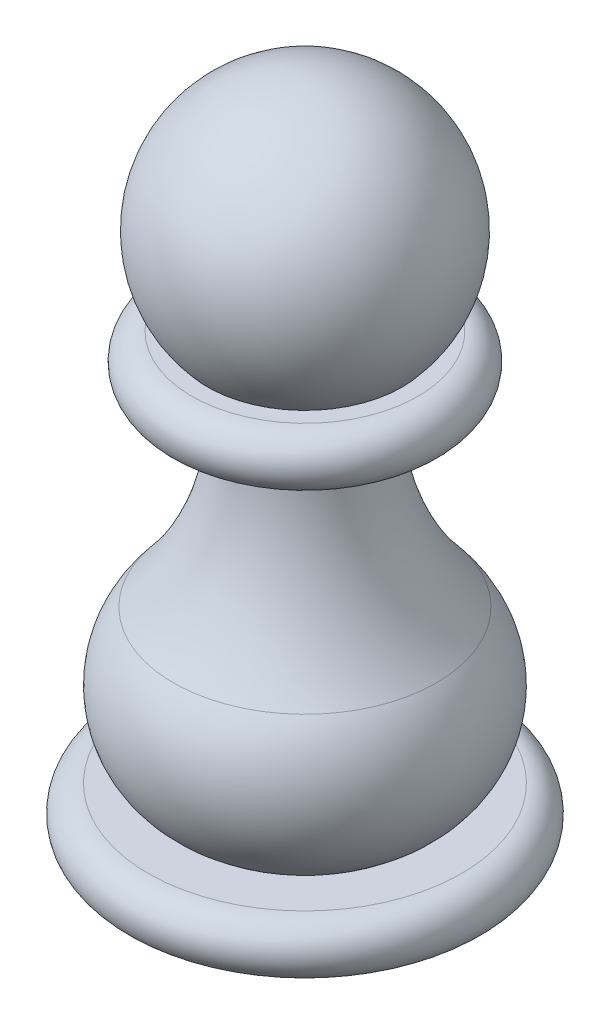
ISO-10303-21;
HEADER;
FILE_DESCRIPTION(('STEP AP214'),'2;1');
FILE_NAME('part.step','',(''),(''),'','','');
FILE_SCHEMA(('AUTOMOTIVE_DESIGN { 1 0 10303 214 1 1 1 1 }'));
ENDSEC;
DATA;
#1=APPLICATION_CONTEXT('core data for automotive mechanical design processes');
#2=APPLICATION_PROTOCOL_DEFINITION('international standard','automotive_design',2000,#1);
#3=PRODUCT_CONTEXT('',#1,'mechanical');
#4=PRODUCT('Part','Part','',(#3));
#5=PRODUCT_RELATED_PRODUCT_CATEGORY('part','',(#4));
#6=PRODUCT_DEFINITION_FORMATION('','',#4);
#7=PRODUCT_DEFINITION_CONTEXT('part definition',#1,'design');
#8=PRODUCT_DEFINITION('design','',#6,#7);
#9=PRODUCT_DEFINITION_SHAPE('','',#8);
#10=(LENGTH_UNIT() NAMED_UNIT(*) SI_UNIT(.MILLI.,.METRE.));
#11=(NAMED_UNIT(*) PLANE_ANGLE_UNIT() SI_UNIT($,.RADIAN.));
#12=(NAMED_UNIT(*) SI_UNIT($,.STERADIAN.) SOLID_ANGLE_UNIT());
#13=UNCERTAINTY_MEASURE_WITH_UNIT(LENGTH_MEASURE(1.E-05),#10,'distance_accuracy_value','');
#14=(GEOMETRIC_REPRESENTATION_CONTEXT(3) GLOBAL_UNCERTAINTY_ASSIGNED_CONTEXT((#13)) GLOBAL_UNIT_ASSIGNED_CONTEXT((#10,
#11,#12)) REPRESENTATION_CONTEXT('',''));
#15=CARTESIAN_POINT('',(0.,0.,0.));
#16=DIRECTION('',(0.,0.,1.));
#17=DIRECTION('',(1.,0.,0.));
#18=AXIS2_PLACEMENT_3D('',#15,#16,#17);
#19=CARTESIAN_POINT('',(0.,30.5,0.));
#20=DIRECTION('',(0.,1.,0.));
#21=DIRECTION('',(1.,0.,0.));
#22=AXIS2_PLACEMENT_3D('',#19,#20,#21);
#23=SPHERICAL_SURFACE('',#22,7.5);
#24=CARTESIAN_POINT('',(0.,25.5,0.));
#25=DIRECTION('',(0.,1.,0.));
#26=DIRECTION('',(-1.,0.,0.));
#27=AXIS2_PLACEMENT_3D('',#24,#25,#26);
#28=CIRCLE('',#27,5.59016994374947);
#29=CARTESIAN_POINT('',(-5.59016994374947,25.5,0.));
#30=VERTEX_POINT('',#29);
#31=EDGE_CURVE('E78',#30,#30,#28,.T.);
#32=ORIENTED_EDGE('',*,*,#31,.T.);
#33=EDGE_LOOP('',(#32));
#34=FACE_BOUND('',#33,.T.);
#35=ADVANCED_FACE('F43',(#34),#23,.T.);
#36=CARTESIAN_POINT('',(9.00000000000001,0.,0.));
#37=DIRECTION('',(0.,1.,0.));
#38=DIRECTION('',(-1.,0.,0.));
#39=AXIS2_PLACEMENT_3D('',#36,#37,#38);
#40=PLANE('',#39);
#41=CARTESIAN_POINT('',(0.,0.,0.));
#42=DIRECTION('',(0.,1.,0.));
#43=DIRECTION('',(-1.,0.,0.));
#44=AXIS2_PLACEMENT_3D('',#41,#42,#43);
#45=CIRCLE('',#44,9.00000000000001);
#46=CARTESIAN_POINT('',(-9.00000000000001,0.,0.));
#47=VERTEX_POINT('',#46);
#48=EDGE_CURVE('E10',#47,#47,#45,.T.);
#49=ORIENTED_EDGE('',*,*,#48,.F.);
#50=EDGE_LOOP('',(#49));
#51=FACE_BOUND('',#50,.T.);
#52=ADVANCED_FACE('F121',(#51),#40,.F.);
#53=CARTESIAN_POINT('',(0.,1.5,0.));
#54=DIRECTION('',(0.,1.,0.));
#55=DIRECTION('',(-1.,0.,0.));
#56=AXIS2_PLACEMENT_3D('',#53,#54,#55);
#57=TOROIDAL_SURFACE('',#56,9.00000000000001,1.5);
#58=CARTESIAN_POINT('',(0.,3.,0.));
#59=DIRECTION('',(0.,1.,0.));
#60=DIRECTION('',(-1.,0.,0.));
#61=AXIS2_PLACEMENT_3D('',#58,#59,#60);
#62=CIRCLE('',#61,9.00000000000001);
#63=CARTESIAN_POINT('',(-9.00000000000001,3.,0.));
#64=VERTEX_POINT('',#63);
#65=EDGE_CURVE('E50',#64,#64,#62,.T.);
#66=ORIENTED_EDGE('',*,*,#65,.F.);
#67=EDGE_LOOP('',(#66));
#68=FACE_BOUND('',#67,.T.);
#69=ORIENTED_EDGE('',*,*,#48,.T.);
#70=EDGE_LOOP('',(#69));
#71=FACE_BOUND('',#70,.T.);
#72=ADVANCED_FACE('F116',(#68,#71),#57,.T.);
#73=CARTESIAN_POINT('',(9.00000000000001,3.,0.));
#74=DIRECTION('',(0.,-1.,0.));
#75=DIRECTION('',(1.,0.,0.));
#76=AXIS2_PLACEMENT_3D('',#73,#74,#75);
#77=PLANE('',#76);
#78=CARTESIAN_POINT('',(0.,3.,0.));
#79=DIRECTION('',(0.,1.,0.));
#80=DIRECTION('',(-1.,0.,0.));
#81=AXIS2_PLACEMENT_3D('',#78,#79,#80);
#82=CIRCLE('',#81,6.5);
#83=CARTESIAN_POINT('',(-6.5,3.,0.));
#84=VERTEX_POINT('',#83);
#85=EDGE_CURVE('E55',#84,#84,#82,.T.);
#86=ORIENTED_EDGE('',*,*,#85,.F.);
#87=EDGE_LOOP('',(#86));
#88=FACE_BOUND('',#87,.T.);
#89=ORIENTED_EDGE('',*,*,#65,.T.);
#90=EDGE_LOOP('',(#89));
#91=FACE_BOUND('',#90,.T.);
#92=ADVANCED_FACE('F111',(#88,#91),#77,.F.);
#93=CARTESIAN_POINT('',(0.,7.87339717240448,0.));
#94=DIRECTION('',(0.,1.,0.));
#95=DIRECTION('',(-1.,0.,0.));
#96=AXIS2_PLACEMENT_3D('',#93,#94,#95);
#97=DEGENERATE_TOROIDAL_SURFACE('',#96,3.,6.,.T.);
#98=CARTESIAN_POINT('',(0.,11.7704306233132,0.));
#99=DIRECTION('',(0.,1.,0.));
#100=DIRECTION('',(-1.,0.,0.));
#101=AXIS2_PLACEMENT_3D('',#98,#99,#100);
#102=CIRCLE('',#101,7.56214097573703);
#103=CARTESIAN_POINT('',(-7.56214097573703,11.7704306233132,0.));
#104=VERTEX_POINT('',#103);
#105=EDGE_CURVE('E60',#104,#104,#102,.T.);
#106=ORIENTED_EDGE('',*,*,#105,.F.);
#107=EDGE_LOOP('',(#106));
#108=FACE_BOUND('',#107,.T.);
#109=ORIENTED_EDGE('',*,*,#85,.T.);
#110=EDGE_LOOP('',(#109));
#111=FACE_BOUND('',#110,.T.);
#112=ADVANCED_FACE('F105',(#108,#111),#97,.T.);
#113=CARTESIAN_POINT('',(0.,21.5130142505848,0.));
#114=DIRECTION('',(0.,1.,0.));
#115=DIRECTION('',(-1.,0.,0.));
#116=AXIS2_PLACEMENT_3D('',#113,#114,#115);
#117=TOROIDAL_SURFACE('',#116,18.9674934150796,15.);
#118=CARTESIAN_POINT('',(0.,22.5,0.));
#119=DIRECTION('',(0.,1.,0.));
#120=DIRECTION('',(-1.,0.,0.));
#121=AXIS2_PLACEMENT_3D('',#118,#119,#120);
#122=CIRCLE('',#121,4.);
#123=CARTESIAN_POINT('',(-4.,22.5,0.));
#124=VERTEX_POINT('',#123);
#125=EDGE_CURVE('E66',#124,#124,#122,.T.);
#126=ORIENTED_EDGE('',*,*,#125,.F.);
#127=EDGE_LOOP('',(#126));
#128=FACE_BOUND('',#127,.T.);
#129=ORIENTED_EDGE('',*,*,#105,.T.);
#130=EDGE_LOOP('',(#129));
#131=FACE_BOUND('',#130,.T.);
#132=ADVANCED_FACE('F99',(#128,#131),#117,.F.);
#133=CARTESIAN_POINT('',(6.5,22.5,0.));
#134=DIRECTION('',(0.,1.,0.));
#135=DIRECTION('',(-1.,0.,0.));
#136=AXIS2_PLACEMENT_3D('',#133,#134,#135);
#137=PLANE('',#136);
#138=CARTESIAN_POINT('',(0.,22.5,0.));
#139=DIRECTION('',(0.,1.,0.));
#140=DIRECTION('',(-1.,0.,0.));
#141=AXIS2_PLACEMENT_3D('',#138,#139,#140);
#142=CIRCLE('',#141,6.5);
#143=CARTESIAN_POINT('',(-6.5,22.5,0.));
#144=VERTEX_POINT('',#143);
#145=EDGE_CURVE('E70',#144,#144,#142,.T.);
#146=ORIENTED_EDGE('',*,*,#145,.F.);
#147=EDGE_LOOP('',(#146));
#148=FACE_BOUND('',#147,.T.);
#149=ORIENTED_EDGE('',*,*,#125,.T.);
#150=EDGE_LOOP('',(#149));
#151=FACE_BOUND('',#150,.T.);
#152=ADVANCED_FACE('F93',(#148,#151),#137,.F.);
#153=CARTESIAN_POINT('',(0.,24.,0.));
#154=DIRECTION('',(0.,1.,0.));
#155=DIRECTION('',(-1.,0.,0.));
#156=AXIS2_PLACEMENT_3D('',#153,#154,#155);
#157=TOROIDAL_SURFACE('',#156,6.5,1.5);
#158=CARTESIAN_POINT('',(0.,25.5,0.));
#159=DIRECTION('',(0.,1.,0.));
#160=DIRECTION('',(-1.,0.,0.));
#161=AXIS2_PLACEMENT_3D('',#158,#159,#160);
#162=CIRCLE('',#161,6.5);
#163=CARTESIAN_POINT('',(-6.5,25.5,0.));
#164=VERTEX_POINT('',#163);
#165=EDGE_CURVE('E74',#164,#164,#162,.T.);
#166=ORIENTED_EDGE('',*,*,#165,.F.);
#167=EDGE_LOOP('',(#166));
#168=FACE_BOUND('',#167,.T.);
#169=ORIENTED_EDGE('',*,*,#145,.T.);
#170=EDGE_LOOP('',(#169));
#171=FACE_BOUND('',#170,.T.);
#172=ADVANCED_FACE('F87',(#168,#171),#157,.T.);
#173=CARTESIAN_POINT('',(5.59016994374947,25.5,0.));
#174=DIRECTION('',(0.,-1.,0.));
#175=DIRECTION('',(1.,0.,0.));
#176=AXIS2_PLACEMENT_3D('',#173,#174,#175);
#177=PLANE('',#176);
#178=ORIENTED_EDGE('',*,*,#31,.F.);
#179=EDGE_LOOP('',(#178));
#180=FACE_BOUND('',#179,.T.);
#181=ORIENTED_EDGE('',*,*,#165,.T.);
#182=EDGE_LOOP('',(#181));
#183=FACE_BOUND('',#182,.T.);
#184=ADVANCED_FACE('F84',(#180,#183),#177,.F.);
#185=CLOSED_SHELL('',(#35,#52,#72,#92,#112,#132,#152,#172,#184));
#186=MANIFOLD_SOLID_BREP('B2',#185);
#187=ADVANCED_BREP_SHAPE_REPRESENTATION('',(#18,#186),#14);
#188=SHAPE_DEFINITION_REPRESENTATION(#9,#187);
ENDSEC;
END-ISO-10303-21;
